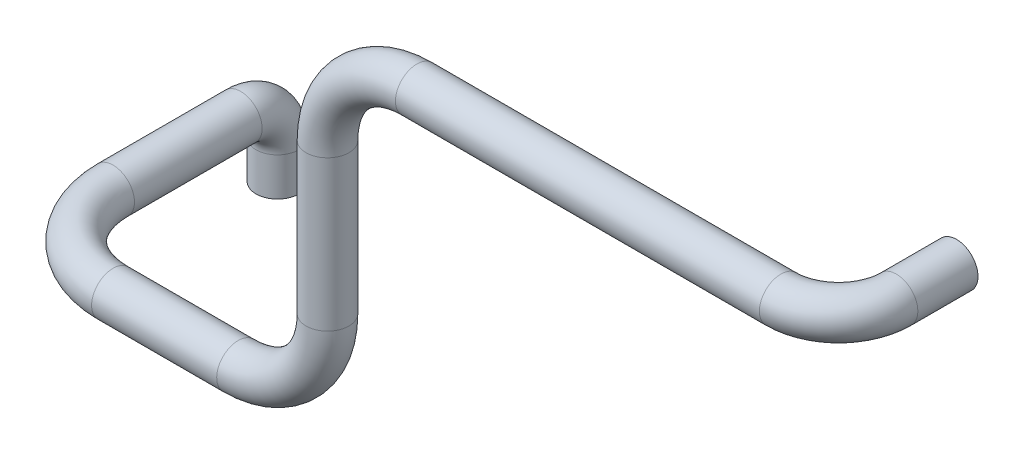
ISO-10303-21;
HEADER;
FILE_DESCRIPTION(('STEP AP214'),'2;1');
FILE_NAME('part.step','',(''),(''),'','','');
FILE_SCHEMA(('AUTOMOTIVE_DESIGN { 1 0 10303 214 1 1 1 1 }'));
ENDSEC;
DATA;
#1=APPLICATION_CONTEXT('core data for automotive mechanical design processes');
#2=APPLICATION_PROTOCOL_DEFINITION('international standard','automotive_design',2000,#1);
#3=PRODUCT_CONTEXT('',#1,'mechanical');
#4=PRODUCT('Part','Part','',(#3));
#5=PRODUCT_RELATED_PRODUCT_CATEGORY('part','',(#4));
#6=PRODUCT_DEFINITION_FORMATION('','',#4);
#7=PRODUCT_DEFINITION_CONTEXT('part definition',#1,'design');
#8=PRODUCT_DEFINITION('design','',#6,#7);
#9=PRODUCT_DEFINITION_SHAPE('','',#8);
#10=(LENGTH_UNIT() NAMED_UNIT(*) SI_UNIT(.MILLI.,.METRE.));
#11=(NAMED_UNIT(*) PLANE_ANGLE_UNIT() SI_UNIT($,.RADIAN.));
#12=(NAMED_UNIT(*) SI_UNIT($,.STERADIAN.) SOLID_ANGLE_UNIT());
#13=UNCERTAINTY_MEASURE_WITH_UNIT(LENGTH_MEASURE(1.E-05),#10,'distance_accuracy_value','');
#14=(GEOMETRIC_REPRESENTATION_CONTEXT(3) GLOBAL_UNCERTAINTY_ASSIGNED_CONTEXT((#13)) GLOBAL_UNIT_ASSIGNED_CONTEXT((#10,
#11,#12)) REPRESENTATION_CONTEXT('',''));
#15=CARTESIAN_POINT('',(0.,0.,0.));
#16=DIRECTION('',(0.,0.,1.));
#17=DIRECTION('',(1.,0.,0.));
#18=AXIS2_PLACEMENT_3D('',#15,#16,#17);
#19=CARTESIAN_POINT('',(-228.,-113.,-38.));
#20=DIRECTION('',(0.,1.,0.));
#21=DIRECTION('',(0.,0.,1.));
#22=AXIS2_PLACEMENT_3D('',#19,#20,#21);
#23=PLANE('',#22);
#24=CARTESIAN_POINT('',(-228.,-113.,-38.));
#25=DIRECTION('',(0.,1.,0.));
#26=DIRECTION('',(0.,0.,1.));
#27=AXIS2_PLACEMENT_3D('',#24,#25,#26);
#28=CIRCLE('',#27,5.);
#29=CARTESIAN_POINT('',(-228.,-113.,-33.));
#30=VERTEX_POINT('',#29);
#31=EDGE_CURVE('E386',#30,#30,#28,.T.);
#32=ORIENTED_EDGE('',*,*,#31,.T.);
#33=EDGE_LOOP('',(#32));
#34=FACE_BOUND('',#33,.T.);
#35=CARTESIAN_POINT('',(-228.,-113.,-38.));
#36=DIRECTION('',(0.,1.,0.));
#37=DIRECTION('',(0.,0.,1.));
#38=AXIS2_PLACEMENT_3D('',#35,#36,#37);
#39=CIRCLE('',#38,6.00000000000001);
#40=CARTESIAN_POINT('',(-228.,-113.,-32.));
#41=VERTEX_POINT('',#40);
#42=EDGE_CURVE('E70',#41,#41,#39,.T.);
#43=ORIENTED_EDGE('',*,*,#42,.F.);
#44=EDGE_LOOP('',(#43));
#45=FACE_BOUND('',#44,.T.);
#46=ADVANCED_FACE('F67',(#34,#45),#23,.F.);
#47=CARTESIAN_POINT('',(0.,0.,0.));
#48=DIRECTION('',(0.,0.,-1.));
#49=DIRECTION('',(0.,-1.,0.));
#50=AXIS2_PLACEMENT_3D('',#47,#48,#49);
#51=PLANE('',#50);
#52=CARTESIAN_POINT('',(0.,0.,0.));
#53=DIRECTION('',(0.,0.,-1.));
#54=DIRECTION('',(-1.,0.,0.));
#55=AXIS2_PLACEMENT_3D('',#52,#53,#54);
#56=CIRCLE('',#55,5.);
#57=CARTESIAN_POINT('',(5.00000000000003,0.,0.));
#58=VERTEX_POINT('',#57);
#59=EDGE_CURVE('E438',#58,#58,#56,.T.);
#60=ORIENTED_EDGE('',*,*,#59,.F.);
#61=EDGE_LOOP('',(#60));
#62=FACE_BOUND('',#61,.T.);
#63=CARTESIAN_POINT('',(0.,0.,0.));
#64=DIRECTION('',(0.,0.,-1.));
#65=DIRECTION('',(0.,-1.,0.));
#66=AXIS2_PLACEMENT_3D('',#63,#64,#65);
#67=CIRCLE('',#66,6.00000000000001);
#68=CARTESIAN_POINT('',(6.00000000000003,0.,0.));
#69=VERTEX_POINT('',#68);
#70=EDGE_CURVE('E84',#69,#69,#67,.T.);
#71=ORIENTED_EDGE('',*,*,#70,.T.);
#72=EDGE_LOOP('',(#71));
#73=FACE_BOUND('',#72,.T.);
#74=ADVANCED_FACE('F123',(#62,#73),#51,.T.);
#75=CARTESIAN_POINT('',(-228.,-102.29,-38.));
#76=DIRECTION('',(0.,-1.,0.));
#77=DIRECTION('',(0.,0.,-1.));
#78=AXIS2_PLACEMENT_3D('',#75,#76,#77);
#79=CYLINDRICAL_SURFACE('',#78,6.00000000000001);
#80=ORIENTED_EDGE('',*,*,#42,.T.);
#81=EDGE_LOOP('',(#80));
#82=FACE_BOUND('',#81,.T.);
#83=CARTESIAN_POINT('',(-228.,-102.29,-38.));
#84=DIRECTION('',(0.,0.999999999999997,-7.35235204542765E-08));
#85=DIRECTION('',(0.,7.35235204542765E-08,0.999999999999997));
#86=AXIS2_PLACEMENT_3D('',#83,#84,#85);
#87=CIRCLE('',#86,6.00000000000001);
#88=CARTESIAN_POINT('',(-228.,-102.290000441141,-44.));
#89=VERTEX_POINT('',#88);
#90=EDGE_CURVE('E110',#89,#89,#87,.T.);
#91=ORIENTED_EDGE('',*,*,#90,.F.);
#92=EDGE_LOOP('',(#91));
#93=FACE_BOUND('',#92,.T.);
#94=ADVANCED_FACE('F121',(#82,#93),#79,.T.);
#95=CARTESIAN_POINT('',(-228.,-92.,8.00000000000001));
#96=DIRECTION('',(0.,0.,-1.));
#97=DIRECTION('',(-1.,0.,0.));
#98=AXIS2_PLACEMENT_3D('',#95,#96,#97);
#99=CYLINDRICAL_SURFACE('',#98,6.00000000000001);
#100=CARTESIAN_POINT('',(-228.,-92.,-27.710000756557));
#101=DIRECTION('',(0.,0.,1.));
#102=DIRECTION('',(0.,-1.,0.));
#103=AXIS2_PLACEMENT_3D('',#100,#101,#102);
#104=CIRCLE('',#103,6.00000000000001);
#105=CARTESIAN_POINT('',(-228.,-86.,-27.710000756557));
#106=VERTEX_POINT('',#105);
#107=EDGE_CURVE('E112',#106,#106,#104,.T.);
#108=ORIENTED_EDGE('',*,*,#107,.T.);
#109=EDGE_LOOP('',(#108));
#110=FACE_BOUND('',#109,.T.);
#111=CARTESIAN_POINT('',(-228.,-92.,8.00000000000004));
#112=DIRECTION('',(-6.4233143072553E-08,0.,0.999999999999998));
#113=DIRECTION('',(0.,-1.,0.));
#114=AXIS2_PLACEMENT_3D('',#111,#112,#113);
#115=CIRCLE('',#114,6.00000000000001);
#116=CARTESIAN_POINT('',(-234.,-92.,7.99999961460118));
#117=VERTEX_POINT('',#116);
#118=EDGE_CURVE('E99',#117,#117,#115,.T.);
#119=ORIENTED_EDGE('',*,*,#118,.F.);
#120=EDGE_LOOP('',(#119));
#121=FACE_BOUND('',#120,.T.);
#122=ADVANCED_FACE('F124',(#110,#121),#99,.T.);
#123=CARTESIAN_POINT('',(-228.,-102.289999243443,-27.710000756557));
#124=DIRECTION('',(-1.,0.,0.));
#125=DIRECTION('',(0.,0.,1.));
#126=AXIS2_PLACEMENT_3D('',#123,#124,#125);
#127=TOROIDAL_SURFACE('',#126,10.2899992434431,6.00000000000001);
#128=CARTESIAN_POINT('',(-228.,-102.289999243443,-27.710000756557));
#129=DIRECTION('',(-1.,0.,0.));
#130=DIRECTION('',(0.,0.,1.));
#131=AXIS2_PLACEMENT_3D('',#128,#129,#130);
#132=CIRCLE('',#131,16.2899992434431);
#133=EDGE_CURVE('',#106,#89,#132,.T.);
#134=ORIENTED_EDGE('',*,*,#107,.F.);
#135=ORIENTED_EDGE('',*,*,#90,.T.);
#136=ORIENTED_EDGE('',*,*,#133,.T.);
#137=ORIENTED_EDGE('',*,*,#133,.F.);
#138=EDGE_LOOP('',(#134,#136,#135,#137));
#139=FACE_BOUND('',#138,.T.);
#140=ADVANCED_FACE('F119',(#139),#127,.T.);
#141=CARTESIAN_POINT('',(-168.,-92.,33.));
#142=DIRECTION('',(-1.,0.,0.));
#143=DIRECTION('',(0.,-1.,0.));
#144=AXIS2_PLACEMENT_3D('',#141,#142,#143);
#145=CYLINDRICAL_SURFACE('',#144,6.00000000000001);
#146=CARTESIAN_POINT('',(-203.000001605828,-92.,33.));
#147=DIRECTION('',(1.,0.,0.));
#148=DIRECTION('',(0.,-1.,0.));
#149=AXIS2_PLACEMENT_3D('',#146,#147,#148);
#150=CIRCLE('',#149,6.00000000000001);
#151=CARTESIAN_POINT('',(-203.000001605828,-92.,39.));
#152=VERTEX_POINT('',#151);
#153=EDGE_CURVE('E103',#152,#152,#150,.T.);
#154=ORIENTED_EDGE('',*,*,#153,.T.);
#155=EDGE_LOOP('',(#154));
#156=FACE_BOUND('',#155,.T.);
#157=CARTESIAN_POINT('',(-168.,-92.,33.));
#158=DIRECTION('',(0.999999999999998,-6.42331418235518E-08,0.));
#159=DIRECTION('',(-6.42331418235518E-08,-0.999999999999998,0.));
#160=AXIS2_PLACEMENT_3D('',#157,#158,#159);
#161=CIRCLE('',#160,6.00000000000001);
#162=CARTESIAN_POINT('',(-168.000000385399,-98.,33.));
#163=VERTEX_POINT('',#162);
#164=EDGE_CURVE('E95',#163,#163,#161,.T.);
#165=ORIENTED_EDGE('',*,*,#164,.F.);
#166=EDGE_LOOP('',(#165));
#167=FACE_BOUND('',#166,.T.);
#168=ADVANCED_FACE('F169',(#156,#167),#145,.T.);
#169=CARTESIAN_POINT('',(-203.000001605829,-92.,8.00000160582849));
#170=DIRECTION('',(0.,-1.,0.));
#171=DIRECTION('',(0.,0.,-1.));
#172=AXIS2_PLACEMENT_3D('',#169,#170,#171);
#173=TOROIDAL_SURFACE('',#172,24.9999983941715,6.00000000000001);
#174=CARTESIAN_POINT('',(-203.000001605829,-92.,8.00000160582849));
#175=DIRECTION('',(0.,-1.,0.));
#176=DIRECTION('',(0.,0.,-1.));
#177=AXIS2_PLACEMENT_3D('',#174,#175,#176);
#178=CIRCLE('',#177,30.9999983941715);
#179=EDGE_CURVE('',#152,#117,#178,.T.);
#180=ORIENTED_EDGE('',*,*,#153,.F.);
#181=ORIENTED_EDGE('',*,*,#118,.T.);
#182=ORIENTED_EDGE('',*,*,#179,.T.);
#183=ORIENTED_EDGE('',*,*,#179,.F.);
#184=EDGE_LOOP('',(#180,#182,#181,#183));
#185=FACE_BOUND('',#184,.T.);
#186=ADVANCED_FACE('F162',(#185),#173,.T.);
#187=CARTESIAN_POINT('',(-143.,-25.,33.));
#188=DIRECTION('',(0.,-1.,0.));
#189=DIRECTION('',(0.,0.,-1.));
#190=AXIS2_PLACEMENT_3D('',#187,#188,#189);
#191=CYLINDRICAL_SURFACE('',#190,6.00000000000001);
#192=CARTESIAN_POINT('',(-143.,-67.0000016058284,33.));
#193=DIRECTION('',(0.,1.,0.));
#194=DIRECTION('',(1.,0.,0.));
#195=AXIS2_PLACEMENT_3D('',#192,#193,#194);
#196=CIRCLE('',#195,6.00000000000001);
#197=CARTESIAN_POINT('',(-137.,-67.0000016058284,33.));
#198=VERTEX_POINT('',#197);
#199=EDGE_CURVE('E96',#198,#198,#196,.T.);
#200=ORIENTED_EDGE('',*,*,#199,.T.);
#201=EDGE_LOOP('',(#200));
#202=FACE_BOUND('',#201,.T.);
#203=CARTESIAN_POINT('',(-143.,-24.9999999999999,33.));
#204=DIRECTION('',(-6.42331426562194E-08,0.999999999999998,0.));
#205=DIRECTION('',(0.999999999999998,6.42331426562193E-08,0.));
#206=AXIS2_PLACEMENT_3D('',#203,#204,#205);
#207=CIRCLE('',#206,6.00000000000001);
#208=CARTESIAN_POINT('',(-149.,-25.0000003853988,33.));
#209=VERTEX_POINT('',#208);
#210=EDGE_CURVE('E93',#209,#209,#207,.T.);
#211=ORIENTED_EDGE('',*,*,#210,.F.);
#212=EDGE_LOOP('',(#211));
#213=FACE_BOUND('',#212,.T.);
#214=ADVANCED_FACE('F159',(#202,#213),#191,.T.);
#215=CARTESIAN_POINT('',(-167.999998394172,-67.0000016058284,33.));
#216=DIRECTION('',(0.,0.,-1.));
#217=DIRECTION('',(-1.,0.,0.));
#218=AXIS2_PLACEMENT_3D('',#215,#216,#217);
#219=TOROIDAL_SURFACE('',#218,24.9999983941716,6.00000000000001);
#220=CARTESIAN_POINT('',(-167.999998394172,-67.0000016058284,33.));
#221=DIRECTION('',(0.,0.,-1.));
#222=DIRECTION('',(-1.,0.,0.));
#223=AXIS2_PLACEMENT_3D('',#220,#221,#222);
#224=CIRCLE('',#223,30.9999983941716);
#225=EDGE_CURVE('',#198,#163,#224,.T.);
#226=ORIENTED_EDGE('',*,*,#199,.F.);
#227=ORIENTED_EDGE('',*,*,#164,.T.);
#228=ORIENTED_EDGE('',*,*,#225,.T.);
#229=ORIENTED_EDGE('',*,*,#225,.F.);
#230=EDGE_LOOP('',(#226,#228,#227,#229));
#231=FACE_BOUND('',#230,.T.);
#232=ADVANCED_FACE('F154',(#231),#219,.T.);
#233=CARTESIAN_POINT('',(-16.1699999999999,0.,33.));
#234=DIRECTION('',(-1.,0.,0.));
#235=DIRECTION('',(0.,0.,1.));
#236=AXIS2_PLACEMENT_3D('',#233,#234,#235);
#237=CYLINDRICAL_SURFACE('',#236,6.00000000000001);
#238=CARTESIAN_POINT('',(-118.000001605828,0.,33.));
#239=DIRECTION('',(1.,0.,0.));
#240=DIRECTION('',(0.,-1.,0.));
#241=AXIS2_PLACEMENT_3D('',#238,#239,#240);
#242=CIRCLE('',#241,6.00000000000001);
#243=CARTESIAN_POINT('',(-118.000001605828,6.00000000000004,33.));
#244=VERTEX_POINT('',#243);
#245=EDGE_CURVE('E87',#244,#244,#242,.T.);
#246=ORIENTED_EDGE('',*,*,#245,.T.);
#247=EDGE_LOOP('',(#246));
#248=FACE_BOUND('',#247,.T.);
#249=CARTESIAN_POINT('',(-16.17,0.,33.));
#250=DIRECTION('',(0.999999999999997,0.,7.35235208527466E-08));
#251=DIRECTION('',(0.,-1.,0.));
#252=AXIS2_PLACEMENT_3D('',#249,#250,#251);
#253=CIRCLE('',#252,6.00000000000001);
#254=CARTESIAN_POINT('',(-16.1700004411411,0.,39.));
#255=VERTEX_POINT('',#254);
#256=EDGE_CURVE('E11',#255,#255,#253,.T.);
#257=ORIENTED_EDGE('',*,*,#256,.F.);
#258=EDGE_LOOP('',(#257));
#259=FACE_BOUND('',#258,.T.);
#260=ADVANCED_FACE('F155',(#248,#259),#237,.T.);
#261=CARTESIAN_POINT('',(-118.000001605828,-24.9999983941715,33.));
#262=DIRECTION('',(0.,0.,1.));
#263=DIRECTION('',(1.,0.,0.));
#264=AXIS2_PLACEMENT_3D('',#261,#262,#263);
#265=TOROIDAL_SURFACE('',#264,24.9999983941716,6.00000000000001);
#266=CARTESIAN_POINT('',(-118.000001605828,-24.9999983941715,33.));
#267=DIRECTION('',(0.,0.,1.));
#268=DIRECTION('',(1.,0.,0.));
#269=AXIS2_PLACEMENT_3D('',#266,#267,#268);
#270=CIRCLE('',#269,30.9999983941716);
#271=EDGE_CURVE('',#244,#209,#270,.T.);
#272=ORIENTED_EDGE('',*,*,#245,.F.);
#273=ORIENTED_EDGE('',*,*,#210,.T.);
#274=ORIENTED_EDGE('',*,*,#271,.T.);
#275=ORIENTED_EDGE('',*,*,#271,.F.);
#276=EDGE_LOOP('',(#272,#274,#273,#275));
#277=FACE_BOUND('',#276,.T.);
#278=ADVANCED_FACE('F150',(#277),#265,.T.);
#279=CARTESIAN_POINT('',(0.,0.,0.));
#280=DIRECTION('',(0.,0.,1.));
#281=DIRECTION('',(1.,0.,0.));
#282=AXIS2_PLACEMENT_3D('',#279,#280,#281);
#283=CYLINDRICAL_SURFACE('',#282,6.00000000000001);
#284=CARTESIAN_POINT('',(0.,0.,16.8300011888752));
#285=DIRECTION('',(0.,0.,-1.));
#286=DIRECTION('',(0.,-1.,0.));
#287=AXIS2_PLACEMENT_3D('',#284,#285,#286);
#288=CIRCLE('',#287,6.00000000000001);
#289=CARTESIAN_POINT('',(6.00000000000003,0.,16.8300011888752));
#290=VERTEX_POINT('',#289);
#291=EDGE_CURVE('E73',#290,#290,#288,.T.);
#292=CARTESIAN_POINT('',(6.00000000000003,0.,16.8300011888752));
#293=CARTESIAN_POINT('',(6.00000000000003,0.,16.6546886764911));
#294=CARTESIAN_POINT('',(6.00000000000003,0.,16.479376164107));
#295=CARTESIAN_POINT('',(6.00000000000003,0.,16.1287511393388));
#296=CARTESIAN_POINT('',(6.00000000000003,0.,15.9534386269547));
#297=CARTESIAN_POINT('',(6.00000000000003,0.,15.6028136021864));
#298=CARTESIAN_POINT('',(6.00000000000003,0.,15.4275010898023));
#299=CARTESIAN_POINT('',(6.00000000000003,0.,15.0768760650341));
#300=CARTESIAN_POINT('',(6.00000000000003,0.,14.90156355265));
#301=CARTESIAN_POINT('',(6.00000000000003,0.,14.5509385278817));
#302=CARTESIAN_POINT('',(6.00000000000003,0.,14.3756260154976));
#303=CARTESIAN_POINT('',(6.00000000000003,0.,14.0250009907294));
#304=CARTESIAN_POINT('',(6.00000000000003,0.,13.8496884783453));
#305=CARTESIAN_POINT('',(6.00000000000003,0.,13.499063453577));
#306=CARTESIAN_POINT('',(6.00000000000003,0.,13.3237509411929));
#307=CARTESIAN_POINT('',(6.00000000000003,0.,12.9731259164247));
#308=CARTESIAN_POINT('',(6.00000000000003,0.,12.7978134040405));
#309=CARTESIAN_POINT('',(6.00000000000003,0.,12.4471883792723));
#310=CARTESIAN_POINT('',(6.00000000000003,0.,12.2718758668882));
#311=CARTESIAN_POINT('',(6.00000000000003,0.,11.92125084212));
#312=CARTESIAN_POINT('',(6.00000000000003,0.,11.7459383297358));
#313=CARTESIAN_POINT('',(6.00000000000003,0.,11.3953133049676));
#314=CARTESIAN_POINT('',(6.00000000000003,0.,11.2200007925835));
#315=CARTESIAN_POINT('',(6.00000000000003,0.,10.8693757678153));
#316=CARTESIAN_POINT('',(6.00000000000003,0.,10.6940632554311));
#317=CARTESIAN_POINT('',(6.00000000000003,0.,10.3434382306629));
#318=CARTESIAN_POINT('',(6.00000000000003,0.,10.1681257182788));
#319=CARTESIAN_POINT('',(6.00000000000003,0.,9.81750069351055));
#320=CARTESIAN_POINT('',(6.00000000000003,0.,9.64218818112644));
#321=CARTESIAN_POINT('',(6.00000000000003,0.,9.2915631563582));
#322=CARTESIAN_POINT('',(6.00000000000003,0.,9.11625064397409));
#323=CARTESIAN_POINT('',(6.00000000000003,0.,8.76562561920585));
#324=CARTESIAN_POINT('',(6.00000000000003,0.,8.59031310682173));
#325=CARTESIAN_POINT('',(6.00000000000003,0.,8.2396880820535));
#326=CARTESIAN_POINT('',(6.00000000000003,0.,8.06437556966938));
#327=CARTESIAN_POINT('',(6.00000000000003,0.,7.71375054490115));
#328=CARTESIAN_POINT('',(6.00000000000003,0.,7.53843803251703));
#329=CARTESIAN_POINT('',(6.00000000000003,0.,7.18781300774879));
#330=CARTESIAN_POINT('',(6.00000000000003,0.,7.01250049536468));
#331=CARTESIAN_POINT('',(6.00000000000003,0.,6.66187547059644));
#332=CARTESIAN_POINT('',(6.00000000000003,0.,6.48656295821233));
#333=CARTESIAN_POINT('',(6.00000000000003,0.,6.13593793344409));
#334=CARTESIAN_POINT('',(6.00000000000003,0.,5.96062542105997));
#335=CARTESIAN_POINT('',(6.00000000000003,0.,5.61000039629174));
#336=CARTESIAN_POINT('',(6.00000000000003,0.,5.43468788390762));
#337=CARTESIAN_POINT('',(6.00000000000003,0.,5.08406285913939));
#338=CARTESIAN_POINT('',(6.00000000000003,0.,4.90875034675527));
#339=CARTESIAN_POINT('',(6.00000000000003,0.,4.55812532198703));
#340=CARTESIAN_POINT('',(6.00000000000003,0.,4.38281280960292));
#341=CARTESIAN_POINT('',(6.00000000000003,0.,4.03218778483468));
#342=CARTESIAN_POINT('',(6.00000000000003,0.,3.85687527245057));
#343=CARTESIAN_POINT('',(6.00000000000003,0.,3.50625024768233));
#344=CARTESIAN_POINT('',(6.00000000000003,0.,3.33093773529822));
#345=CARTESIAN_POINT('',(6.00000000000003,0.,2.98031271052998));
#346=CARTESIAN_POINT('',(6.00000000000003,0.,2.80500019814586));
#347=CARTESIAN_POINT('',(6.00000000000003,0.,2.45437517337763));
#348=CARTESIAN_POINT('',(6.00000000000003,0.,2.27906266099351));
#349=CARTESIAN_POINT('',(6.00000000000003,0.,1.92843763622528));
#350=CARTESIAN_POINT('',(6.00000000000003,0.,1.75312512384116));
#351=CARTESIAN_POINT('',(6.00000000000003,0.,1.40250009907292));
#352=CARTESIAN_POINT('',(6.00000000000003,0.,1.22718758668881));
#353=CARTESIAN_POINT('',(6.00000000000003,0.,0.876562561920571));
#354=CARTESIAN_POINT('',(6.00000000000003,0.,0.701250049536454));
#355=CARTESIAN_POINT('',(6.00000000000003,0.,0.35062502476822));
#356=CARTESIAN_POINT('',(6.00000000000003,0.,0.175312512384103));
#357=CARTESIAN_POINT('',(6.00000000000003,0.,0.));
#358=B_SPLINE_CURVE_WITH_KNOTS('',3,(#292,#293,#294,#295,#296,#297,#298,#299,#300,#301,#302,
#303,#304,#305,#306,#307,#308,#309,#310,#311,#312,#313,#314,#315,#316,#317,#318,#319,#320,#321,
#322,#323,#324,#325,#326,#327,#328,#329,#330,#331,#332,#333,#334,#335,#336,#337,#338,#339,#340,
#341,#342,#343,#344,#345,#346,#347,#348,#349,#350,#351,#352,#353,#354,#355,#356,#357),
.UNSPECIFIED.,.F.,.F.,(4,2,2,2,2,2,2,2,2,2,2,2,2,2,2,2,2,2,2,2,2,2,2,2,2,2,2,2,2,2,2,2,4),(0.,
0.525937537152351,1.0518750743047,1.57781261145706,2.10375014860941,2.62968768576176,
3.15562522291411,3.68156276006646,4.20750029721882,4.73343783437117,5.25937537152352,
5.78531290867587,6.31125044582822,6.83718798298057,7.36312552013293,7.88906305728528,
8.41500059443763,8.94093813158998,9.46687566874233,9.99281320589469,10.518750743047,
11.0446882801994,11.5706258173517,12.0965633545041,12.6225008916564,13.1484384288088,
13.6743759659611,14.2003135031135,14.7262510402659,15.2521885774182,15.7781261145706,
16.3040636517229,16.8300011888753),.UNSPECIFIED.);
#359=EDGE_CURVE('BSEAM139',#290,#69,#358,.T.);
#360=ORIENTED_EDGE('',*,*,#291,.T.);
#361=ORIENTED_EDGE('',*,*,#70,.F.);
#362=ORIENTED_EDGE('',*,*,#359,.T.);
#363=ORIENTED_EDGE('',*,*,#359,.F.);
#364=EDGE_LOOP('',(#360,#362,#361,#363));
#365=FACE_BOUND('',#364,.T.);
#366=ADVANCED_FACE('F139',(#365),#283,.T.);
#367=CARTESIAN_POINT('',(-16.1699988111247,0.,16.8300011888753));
#368=DIRECTION('',(0.,-1.,0.));
#369=DIRECTION('',(0.,0.,-1.));
#370=AXIS2_PLACEMENT_3D('',#367,#368,#369);
#371=TOROIDAL_SURFACE('',#370,16.1699988111248,6.00000000000001);
#372=CARTESIAN_POINT('',(-16.1699988111247,0.,16.8300011888753));
#373=DIRECTION('',(0.,-1.,0.));
#374=DIRECTION('',(0.,0.,-1.));
#375=AXIS2_PLACEMENT_3D('',#372,#373,#374);
#376=CIRCLE('',#375,22.1699988111248);
#377=EDGE_CURVE('',#290,#255,#376,.T.);
#378=ORIENTED_EDGE('',*,*,#291,.F.);
#379=ORIENTED_EDGE('',*,*,#256,.T.);
#380=ORIENTED_EDGE('',*,*,#377,.T.);
#381=ORIENTED_EDGE('',*,*,#377,.F.);
#382=EDGE_LOOP('',(#378,#380,#379,#381));
#383=FACE_BOUND('',#382,.T.);
#384=ADVANCED_FACE('F133',(#383),#371,.T.);
#385=CARTESIAN_POINT('',(0.,0.,-1.));
#386=DIRECTION('',(0.,0.,1.));
#387=DIRECTION('',(1.,0.,0.));
#388=AXIS2_PLACEMENT_3D('',#385,#386,#387);
#389=CYLINDRICAL_SURFACE('',#388,5.);
#390=CARTESIAN_POINT('',(0.,0.,16.8300011888752));
#391=DIRECTION('',(0.,0.,-1.));
#392=DIRECTION('',(0.,-1.,0.));
#393=AXIS2_PLACEMENT_3D('',#390,#391,#392);
#394=CIRCLE('',#393,5.);
#395=CARTESIAN_POINT('',(5.00000000000003,0.,16.8300011888752));
#396=VERTEX_POINT('',#395);
#397=EDGE_CURVE('E390',#396,#396,#394,.T.);
#398=CARTESIAN_POINT('',(5.00000000000003,0.,16.8300011888752));
#399=CARTESIAN_POINT('',(5.00000000000003,0.,16.6546886764911));
#400=CARTESIAN_POINT('',(5.00000000000003,0.,16.479376164107));
#401=CARTESIAN_POINT('',(5.00000000000003,0.,16.1287511393387));
#402=CARTESIAN_POINT('',(5.00000000000003,0.,15.9534386269546));
#403=CARTESIAN_POINT('',(5.00000000000003,0.,15.6028136021864));
#404=CARTESIAN_POINT('',(5.00000000000003,0.,15.4275010898023));
#405=CARTESIAN_POINT('',(5.00000000000003,0.,15.076876065034));
#406=CARTESIAN_POINT('',(5.00000000000003,0.,14.9015635526499));
#407=CARTESIAN_POINT('',(5.00000000000003,0.,14.5509385278817));
#408=CARTESIAN_POINT('',(5.00000000000003,0.,14.3756260154976));
#409=CARTESIAN_POINT('',(5.00000000000003,0.,14.0250009907293));
#410=CARTESIAN_POINT('',(5.00000000000003,0.,13.8496884783452));
#411=CARTESIAN_POINT('',(5.00000000000003,0.,13.499063453577));
#412=CARTESIAN_POINT('',(5.00000000000003,0.,13.3237509411929));
#413=CARTESIAN_POINT('',(5.00000000000003,0.,12.9731259164246));
#414=CARTESIAN_POINT('',(5.00000000000003,0.,12.7978134040405));
#415=CARTESIAN_POINT('',(5.00000000000003,0.,12.4471883792723));
#416=CARTESIAN_POINT('',(5.00000000000003,0.,12.2718758668882));
#417=CARTESIAN_POINT('',(5.00000000000003,0.,11.9212508421199));
#418=CARTESIAN_POINT('',(5.00000000000003,0.,11.7459383297358));
#419=CARTESIAN_POINT('',(5.00000000000003,0.,11.3953133049676));
#420=CARTESIAN_POINT('',(5.00000000000003,0.,11.2200007925835));
#421=CARTESIAN_POINT('',(5.00000000000003,0.,10.8693757678152));
#422=CARTESIAN_POINT('',(5.00000000000003,0.,10.6940632554311));
#423=CARTESIAN_POINT('',(5.00000000000003,0.,10.3434382306629));
#424=CARTESIAN_POINT('',(5.00000000000003,0.,10.1681257182788));
#425=CARTESIAN_POINT('',(5.00000000000003,0.,9.81750069351054));
#426=CARTESIAN_POINT('',(5.00000000000003,0.,9.64218818112642));
#427=CARTESIAN_POINT('',(5.00000000000003,0.,9.29156315635819));
#428=CARTESIAN_POINT('',(5.00000000000003,0.,9.11625064397407));
#429=CARTESIAN_POINT('',(5.00000000000003,0.,8.76562561920584));
#430=CARTESIAN_POINT('',(5.00000000000003,0.,8.59031310682172));
#431=CARTESIAN_POINT('',(5.00000000000003,0.,8.23968808205349));
#432=CARTESIAN_POINT('',(5.00000000000003,0.,8.06437556966937));
#433=CARTESIAN_POINT('',(5.00000000000003,0.,7.71375054490113));
#434=CARTESIAN_POINT('',(5.00000000000003,0.,7.53843803251702));
#435=CARTESIAN_POINT('',(5.00000000000003,0.,7.18781300774878));
#436=CARTESIAN_POINT('',(5.00000000000003,0.,7.01250049536467));
#437=CARTESIAN_POINT('',(5.00000000000003,0.,6.66187547059643));
#438=CARTESIAN_POINT('',(5.00000000000003,0.,6.48656295821232));
#439=CARTESIAN_POINT('',(5.00000000000003,0.,6.13593793344408));
#440=CARTESIAN_POINT('',(5.00000000000003,0.,5.96062542105996));
#441=CARTESIAN_POINT('',(5.00000000000003,0.,5.61000039629173));
#442=CARTESIAN_POINT('',(5.00000000000003,0.,5.43468788390761));
#443=CARTESIAN_POINT('',(5.00000000000003,0.,5.08406285913938));
#444=CARTESIAN_POINT('',(5.00000000000003,0.,4.90875034675526));
#445=CARTESIAN_POINT('',(5.00000000000003,0.,4.55812532198703));
#446=CARTESIAN_POINT('',(5.00000000000003,0.,4.38281280960291));
#447=CARTESIAN_POINT('',(5.00000000000003,0.,4.03218778483468));
#448=CARTESIAN_POINT('',(5.00000000000003,0.,3.85687527245056));
#449=CARTESIAN_POINT('',(5.00000000000003,0.,3.50625024768233));
#450=CARTESIAN_POINT('',(5.00000000000003,0.,3.33093773529821));
#451=CARTESIAN_POINT('',(5.00000000000003,0.,2.98031271052998));
#452=CARTESIAN_POINT('',(5.00000000000003,0.,2.80500019814586));
#453=CARTESIAN_POINT('',(5.00000000000003,0.,2.45437517337762));
#454=CARTESIAN_POINT('',(5.00000000000003,0.,2.27906266099351));
#455=CARTESIAN_POINT('',(5.00000000000003,0.,1.92843763622527));
#456=CARTESIAN_POINT('',(5.00000000000003,0.,1.75312512384116));
#457=CARTESIAN_POINT('',(5.00000000000003,0.,1.40250009907292));
#458=CARTESIAN_POINT('',(5.00000000000003,0.,1.22718758668881));
#459=CARTESIAN_POINT('',(5.00000000000003,0.,0.876562561920571));
#460=CARTESIAN_POINT('',(5.00000000000003,0.,0.701250049536454));
#461=CARTESIAN_POINT('',(5.00000000000003,0.,0.35062502476822));
#462=CARTESIAN_POINT('',(5.00000000000003,0.,0.175312512384103));
#463=CARTESIAN_POINT('',(5.00000000000003,0.,0.));
#464=B_SPLINE_CURVE_WITH_KNOTS('',3,(#398,#399,#400,#401,#402,#403,#404,#405,#406,#407,#408,
#409,#410,#411,#412,#413,#414,#415,#416,#417,#418,#419,#420,#421,#422,#423,#424,#425,#426,#427,
#428,#429,#430,#431,#432,#433,#434,#435,#436,#437,#438,#439,#440,#441,#442,#443,#444,#445,#446,
#447,#448,#449,#450,#451,#452,#453,#454,#455,#456,#457,#458,#459,#460,#461,#462,#463),
.UNSPECIFIED.,.F.,.F.,(4,2,2,2,2,2,2,2,2,2,2,2,2,2,2,2,2,2,2,2,2,2,2,2,2,2,2,2,2,2,2,2,4),(0.,
0.525937537152351,1.0518750743047,1.57781261145705,2.1037501486094,2.62968768576176,
3.15562522291411,3.68156276006646,4.20750029721881,4.73343783437116,5.25937537152351,
5.78531290867586,6.31125044582821,6.83718798298056,7.36312552013291,7.88906305728526,
8.41500059443762,8.94093813158997,9.46687566874232,9.99281320589467,10.518750743047,
11.0446882801994,11.5706258173517,12.0965633545041,12.6225008916564,13.1484384288088,
13.6743759659611,14.2003135031135,14.7262510402658,15.2521885774182,15.7781261145705,
16.3040636517229,16.8300011888752),.UNSPECIFIED.);
#465=EDGE_CURVE('BSEAM137',#396,#58,#464,.T.);
#466=ORIENTED_EDGE('',*,*,#397,.F.);
#467=ORIENTED_EDGE('',*,*,#59,.T.);
#468=ORIENTED_EDGE('',*,*,#465,.T.);
#469=ORIENTED_EDGE('',*,*,#465,.F.);
#470=EDGE_LOOP('',(#466,#468,#467,#469));
#471=FACE_BOUND('',#470,.T.);
#472=ADVANCED_FACE('F137',(#471),#389,.F.);
#473=CARTESIAN_POINT('',(-228.,-102.29,-38.));
#474=DIRECTION('',(0.,-1.,0.));
#475=DIRECTION('',(0.,0.,-1.));
#476=AXIS2_PLACEMENT_3D('',#473,#474,#475);
#477=CYLINDRICAL_SURFACE('',#476,5.);
#478=ORIENTED_EDGE('',*,*,#31,.F.);
#479=EDGE_LOOP('',(#478));
#480=FACE_BOUND('',#479,.T.);
#481=CARTESIAN_POINT('',(-228.,-102.29,-38.));
#482=DIRECTION('',(0.,0.999999999999997,-7.35235204542765E-08));
#483=DIRECTION('',(0.,7.35235204542765E-08,0.999999999999997));
#484=AXIS2_PLACEMENT_3D('',#481,#482,#483);
#485=CIRCLE('',#484,5.);
#486=CARTESIAN_POINT('',(-228.,-102.290000367618,-43.));
#487=VERTEX_POINT('',#486);
#488=EDGE_CURVE('E406',#487,#487,#485,.T.);
#489=ORIENTED_EDGE('',*,*,#488,.T.);
#490=EDGE_LOOP('',(#489));
#491=FACE_BOUND('',#490,.T.);
#492=ADVANCED_FACE('F141',(#480,#491),#477,.F.);
#493=CARTESIAN_POINT('',(-228.,-92.,8.00000000000004));
#494=DIRECTION('',(0.,0.,-1.));
#495=DIRECTION('',(-1.,0.,0.));
#496=AXIS2_PLACEMENT_3D('',#493,#494,#495);
#497=CYLINDRICAL_SURFACE('',#496,5.);
#498=CARTESIAN_POINT('',(-228.,-92.,-27.7100007565569));
#499=DIRECTION('',(0.,0.,1.));
#500=DIRECTION('',(0.,-1.,0.));
#501=AXIS2_PLACEMENT_3D('',#498,#499,#500);
#502=CIRCLE('',#501,5.);
#503=CARTESIAN_POINT('',(-228.,-87.,-27.7100007565569));
#504=VERTEX_POINT('',#503);
#505=EDGE_CURVE('E391',#504,#504,#502,.T.);
#506=ORIENTED_EDGE('',*,*,#505,.F.);
#507=EDGE_LOOP('',(#506));
#508=FACE_BOUND('',#507,.T.);
#509=CARTESIAN_POINT('',(-228.,-92.,8.00000000000006));
#510=DIRECTION('',(-6.4233143072553E-08,0.,0.999999999999998));
#511=DIRECTION('',(0.,-1.,0.));
#512=AXIS2_PLACEMENT_3D('',#509,#510,#511);
#513=CIRCLE('',#512,5.);
#514=CARTESIAN_POINT('',(-233.,-92.,7.99999967883436));
#515=VERTEX_POINT('',#514);
#516=EDGE_CURVE('E418',#515,#515,#513,.T.);
#517=ORIENTED_EDGE('',*,*,#516,.T.);
#518=EDGE_LOOP('',(#517));
#519=FACE_BOUND('',#518,.T.);
#520=ADVANCED_FACE('F233',(#508,#519),#497,.F.);
#521=CARTESIAN_POINT('',(-228.,-102.289999243443,-27.710000756557));
#522=DIRECTION('',(-1.,0.,0.));
#523=DIRECTION('',(0.,0.,1.));
#524=AXIS2_PLACEMENT_3D('',#521,#522,#523);
#525=TOROIDAL_SURFACE('',#524,10.2899992434431,5.);
#526=CARTESIAN_POINT('',(-228.,-102.289999243443,-27.710000756557));
#527=DIRECTION('',(-1.,0.,0.));
#528=DIRECTION('',(0.,0.,1.));
#529=AXIS2_PLACEMENT_3D('',#526,#527,#528);
#530=CIRCLE('',#529,15.2899992434431);
#531=EDGE_CURVE('',#504,#487,#530,.T.);
#532=ORIENTED_EDGE('',*,*,#505,.T.);
#533=ORIENTED_EDGE('',*,*,#488,.F.);
#534=ORIENTED_EDGE('',*,*,#531,.T.);
#535=ORIENTED_EDGE('',*,*,#531,.F.);
#536=EDGE_LOOP('',(#532,#534,#533,#535));
#537=FACE_BOUND('',#536,.T.);
#538=ADVANCED_FACE('F241',(#537),#525,.F.);
#539=CARTESIAN_POINT('',(-168.,-92.,33.));
#540=DIRECTION('',(-1.,0.,0.));
#541=DIRECTION('',(0.,-1.,0.));
#542=AXIS2_PLACEMENT_3D('',#539,#540,#541);
#543=CYLINDRICAL_SURFACE('',#542,5.);
#544=CARTESIAN_POINT('',(-203.000001605828,-92.,33.));
#545=DIRECTION('',(1.,0.,0.));
#546=DIRECTION('',(0.,-1.,0.));
#547=AXIS2_PLACEMENT_3D('',#544,#545,#546);
#548=CIRCLE('',#547,5.);
#549=CARTESIAN_POINT('',(-203.000001605828,-92.,38.));
#550=VERTEX_POINT('',#549);
#551=EDGE_CURVE('E411',#550,#550,#548,.T.);
#552=ORIENTED_EDGE('',*,*,#551,.F.);
#553=EDGE_LOOP('',(#552));
#554=FACE_BOUND('',#553,.T.);
#555=CARTESIAN_POINT('',(-168.,-92.,33.));
#556=DIRECTION('',(0.999999999999998,-6.42331418235518E-08,0.));
#557=DIRECTION('',(-6.42331418235518E-08,-0.999999999999998,0.));
#558=AXIS2_PLACEMENT_3D('',#555,#556,#557);
#559=CIRCLE('',#558,5.);
#560=CARTESIAN_POINT('',(-168.000000321166,-97.,33.));
#561=VERTEX_POINT('',#560);
#562=EDGE_CURVE('E404',#561,#561,#559,.T.);
#563=ORIENTED_EDGE('',*,*,#562,.T.);
#564=EDGE_LOOP('',(#563));
#565=FACE_BOUND('',#564,.T.);
#566=ADVANCED_FACE('F255',(#554,#565),#543,.F.);
#567=CARTESIAN_POINT('',(-203.000001605829,-92.,8.00000160582849));
#568=DIRECTION('',(0.,-1.,0.));
#569=DIRECTION('',(0.,0.,-1.));
#570=AXIS2_PLACEMENT_3D('',#567,#568,#569);
#571=TOROIDAL_SURFACE('',#570,24.9999983941715,5.);
#572=CARTESIAN_POINT('',(-203.000001605829,-92.,8.00000160582849));
#573=DIRECTION('',(0.,-1.,0.));
#574=DIRECTION('',(0.,0.,-1.));
#575=AXIS2_PLACEMENT_3D('',#572,#573,#574);
#576=CIRCLE('',#575,29.9999983941715);
#577=EDGE_CURVE('',#550,#515,#576,.T.);
#578=ORIENTED_EDGE('',*,*,#551,.T.);
#579=ORIENTED_EDGE('',*,*,#516,.F.);
#580=ORIENTED_EDGE('',*,*,#577,.T.);
#581=ORIENTED_EDGE('',*,*,#577,.F.);
#582=EDGE_LOOP('',(#578,#580,#579,#581));
#583=FACE_BOUND('',#582,.T.);
#584=ADVANCED_FACE('F262',(#583),#571,.F.);
#585=CARTESIAN_POINT('',(-143.,-24.9999999999999,33.));
#586=DIRECTION('',(0.,-1.,0.));
#587=DIRECTION('',(0.,0.,-1.));
#588=AXIS2_PLACEMENT_3D('',#585,#586,#587);
#589=CYLINDRICAL_SURFACE('',#588,5.);
#590=CARTESIAN_POINT('',(-143.,-67.0000016058283,33.));
#591=DIRECTION('',(0.,1.,0.));
#592=DIRECTION('',(1.,0.,0.));
#593=AXIS2_PLACEMENT_3D('',#590,#591,#592);
#594=CIRCLE('',#593,5.);
#595=CARTESIAN_POINT('',(-138.,-67.0000016058283,33.));
#596=VERTEX_POINT('',#595);
#597=EDGE_CURVE('E410',#596,#596,#594,.T.);
#598=ORIENTED_EDGE('',*,*,#597,.F.);
#599=EDGE_LOOP('',(#598));
#600=FACE_BOUND('',#599,.T.);
#601=CARTESIAN_POINT('',(-143.,-24.9999999999999,33.));
#602=DIRECTION('',(-6.42331426562194E-08,0.999999999999998,0.));
#603=DIRECTION('',(0.999999999999998,6.42331426562193E-08,0.));
#604=AXIS2_PLACEMENT_3D('',#601,#602,#603);
#605=CIRCLE('',#604,5.);
#606=CARTESIAN_POINT('',(-148.,-25.0000003211656,33.));
#607=VERTEX_POINT('',#606);
#608=EDGE_CURVE('E427',#607,#607,#605,.T.);
#609=ORIENTED_EDGE('',*,*,#608,.T.);
#610=EDGE_LOOP('',(#609));
#611=FACE_BOUND('',#610,.T.);
#612=ADVANCED_FACE('F273',(#600,#611),#589,.F.);
#613=CARTESIAN_POINT('',(-167.999998394172,-67.0000016058284,33.));
#614=DIRECTION('',(0.,0.,-1.));
#615=DIRECTION('',(-1.,0.,0.));
#616=AXIS2_PLACEMENT_3D('',#613,#614,#615);
#617=TOROIDAL_SURFACE('',#616,24.9999983941716,5.);
#618=CARTESIAN_POINT('',(-167.999998394172,-67.0000016058284,33.));
#619=DIRECTION('',(0.,0.,-1.));
#620=DIRECTION('',(-1.,0.,0.));
#621=AXIS2_PLACEMENT_3D('',#618,#619,#620);
#622=CIRCLE('',#621,29.9999983941716);
#623=EDGE_CURVE('',#596,#561,#622,.T.);
#624=ORIENTED_EDGE('',*,*,#597,.T.);
#625=ORIENTED_EDGE('',*,*,#562,.F.);
#626=ORIENTED_EDGE('',*,*,#623,.T.);
#627=ORIENTED_EDGE('',*,*,#623,.F.);
#628=EDGE_LOOP('',(#624,#626,#625,#627));
#629=FACE_BOUND('',#628,.T.);
#630=ADVANCED_FACE('F281',(#629),#617,.F.);
#631=CARTESIAN_POINT('',(-16.1699999999999,0.,33.));
#632=DIRECTION('',(-1.,0.,0.));
#633=DIRECTION('',(0.,0.,1.));
#634=AXIS2_PLACEMENT_3D('',#631,#632,#633);
#635=CYLINDRICAL_SURFACE('',#634,5.);
#636=CARTESIAN_POINT('',(-118.000001605828,0.,33.));
#637=DIRECTION('',(1.,0.,0.));
#638=DIRECTION('',(0.,-1.,0.));
#639=AXIS2_PLACEMENT_3D('',#636,#637,#638);
#640=CIRCLE('',#639,5.);
#641=CARTESIAN_POINT('',(-118.000001605828,5.00000000000004,33.));
#642=VERTEX_POINT('',#641);
#643=EDGE_CURVE('E407',#642,#642,#640,.T.);
#644=ORIENTED_EDGE('',*,*,#643,.F.);
#645=EDGE_LOOP('',(#644));
#646=FACE_BOUND('',#645,.T.);
#647=CARTESIAN_POINT('',(-16.1699999999999,0.,33.));
#648=DIRECTION('',(0.999999999999997,0.,7.35235208527466E-08));
#649=DIRECTION('',(0.,-1.,0.));
#650=AXIS2_PLACEMENT_3D('',#647,#648,#649);
#651=CIRCLE('',#650,5.);
#652=CARTESIAN_POINT('',(-16.1700003676175,0.,38.));
#653=VERTEX_POINT('',#652);
#654=EDGE_CURVE('E383',#653,#653,#651,.T.);
#655=ORIENTED_EDGE('',*,*,#654,.T.);
#656=EDGE_LOOP('',(#655));
#657=FACE_BOUND('',#656,.T.);
#658=ADVANCED_FACE('F294',(#646,#657),#635,.F.);
#659=CARTESIAN_POINT('',(-118.000001605828,-24.9999983941715,33.));
#660=DIRECTION('',(0.,0.,1.));
#661=DIRECTION('',(1.,0.,0.));
#662=AXIS2_PLACEMENT_3D('',#659,#660,#661);
#663=TOROIDAL_SURFACE('',#662,24.9999983941716,5.);
#664=CARTESIAN_POINT('',(-118.000001605828,-24.9999983941715,33.));
#665=DIRECTION('',(0.,0.,1.));
#666=DIRECTION('',(1.,0.,0.));
#667=AXIS2_PLACEMENT_3D('',#664,#665,#666);
#668=CIRCLE('',#667,29.9999983941716);
#669=EDGE_CURVE('',#642,#607,#668,.T.);
#670=ORIENTED_EDGE('',*,*,#643,.T.);
#671=ORIENTED_EDGE('',*,*,#608,.F.);
#672=ORIENTED_EDGE('',*,*,#669,.T.);
#673=ORIENTED_EDGE('',*,*,#669,.F.);
#674=EDGE_LOOP('',(#670,#672,#671,#673));
#675=FACE_BOUND('',#674,.T.);
#676=ADVANCED_FACE('F303',(#675),#663,.F.);
#677=CARTESIAN_POINT('',(-16.1699988111247,0.,16.8300011888753));
#678=DIRECTION('',(0.,-1.,0.));
#679=DIRECTION('',(0.,0.,-1.));
#680=AXIS2_PLACEMENT_3D('',#677,#678,#679);
#681=TOROIDAL_SURFACE('',#680,16.1699988111248,5.);
#682=CARTESIAN_POINT('',(-16.1699988111247,0.,16.8300011888753));
#683=DIRECTION('',(0.,-1.,0.));
#684=DIRECTION('',(0.,0.,-1.));
#685=AXIS2_PLACEMENT_3D('',#682,#683,#684);
#686=CIRCLE('',#685,21.1699988111248);
#687=EDGE_CURVE('',#396,#653,#686,.T.);
#688=ORIENTED_EDGE('',*,*,#397,.T.);
#689=ORIENTED_EDGE('',*,*,#654,.F.);
#690=ORIENTED_EDGE('',*,*,#687,.T.);
#691=ORIENTED_EDGE('',*,*,#687,.F.);
#692=EDGE_LOOP('',(#688,#690,#689,#691));
#693=FACE_BOUND('',#692,.T.);
#694=ADVANCED_FACE('F148',(#693),#681,.F.);
#695=CLOSED_SHELL('',(#46,#74,#94,#122,#140,#168,#186,#214,#232,#260,#278,#366,#384,#472,#492,
#520,#538,#566,#584,#612,#630,#658,#676,#694));
#696=MANIFOLD_SOLID_BREP('B2',#695);
#697=ADVANCED_BREP_SHAPE_REPRESENTATION('',(#18,#696),#14);
#698=SHAPE_DEFINITION_REPRESENTATION(#9,#697);
ENDSEC;
END-ISO-10303-21;
